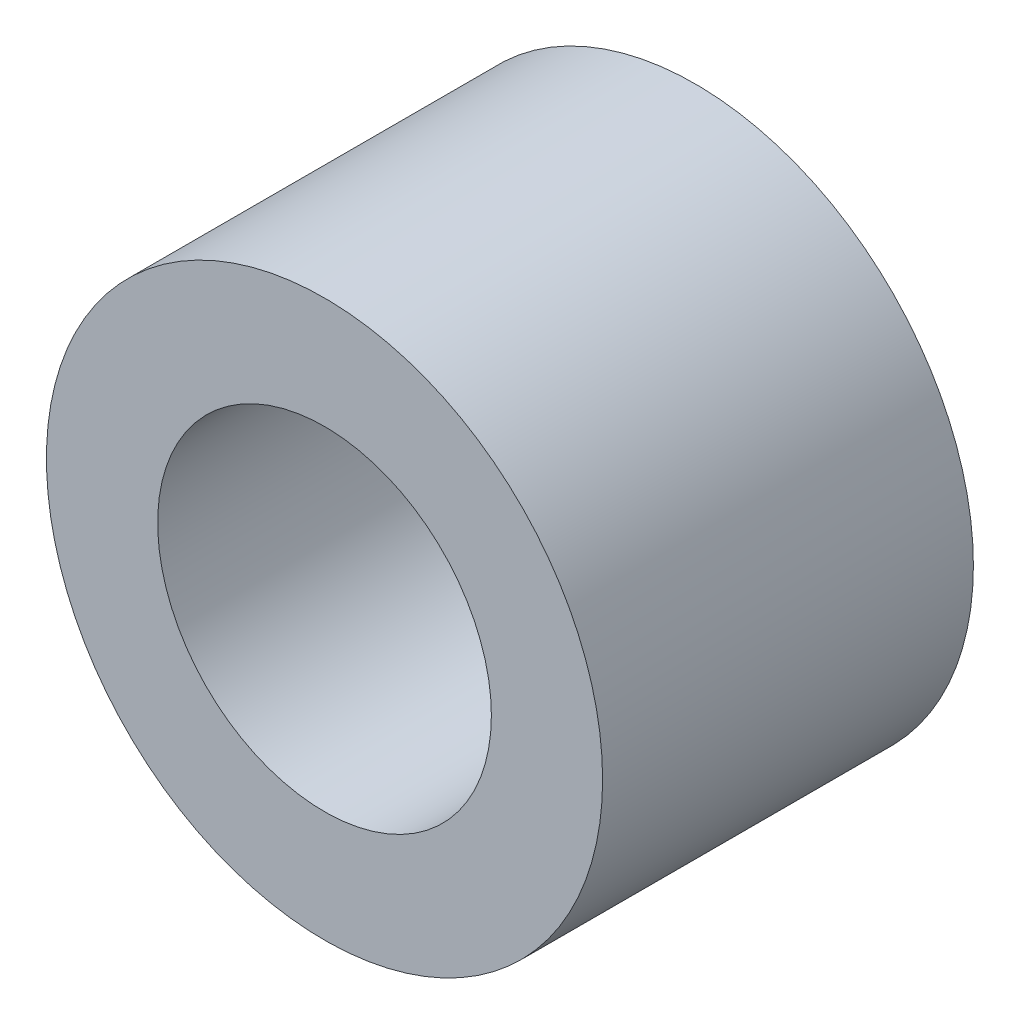
ISO-10303-21;
HEADER;
FILE_DESCRIPTION(('STEP AP214'),'2;1');
FILE_NAME('part.step','',(''),(''),'','','');
FILE_SCHEMA(('AUTOMOTIVE_DESIGN { 1 0 10303 214 1 1 1 1 }'));
ENDSEC;
DATA;
#1=APPLICATION_CONTEXT('core data for automotive mechanical design processes');
#2=APPLICATION_PROTOCOL_DEFINITION('international standard','automotive_design',2000,#1);
#3=PRODUCT_CONTEXT('',#1,'mechanical');
#4=PRODUCT('Part','Part','',(#3));
#5=PRODUCT_RELATED_PRODUCT_CATEGORY('part','',(#4));
#6=PRODUCT_DEFINITION_FORMATION('','',#4);
#7=PRODUCT_DEFINITION_CONTEXT('part definition',#1,'design');
#8=PRODUCT_DEFINITION('design','',#6,#7);
#9=PRODUCT_DEFINITION_SHAPE('','',#8);
#10=(LENGTH_UNIT() NAMED_UNIT(*) SI_UNIT(.MILLI.,.METRE.));
#11=(NAMED_UNIT(*) PLANE_ANGLE_UNIT() SI_UNIT($,.RADIAN.));
#12=(NAMED_UNIT(*) SI_UNIT($,.STERADIAN.) SOLID_ANGLE_UNIT());
#13=UNCERTAINTY_MEASURE_WITH_UNIT(LENGTH_MEASURE(1.E-05),#10,'distance_accuracy_value','');
#14=(GEOMETRIC_REPRESENTATION_CONTEXT(3) GLOBAL_UNCERTAINTY_ASSIGNED_CONTEXT((#13)) GLOBAL_UNIT_ASSIGNED_CONTEXT((#10,
#11,#12)) REPRESENTATION_CONTEXT('',''));
#15=CARTESIAN_POINT('',(0.,0.,0.));
#16=DIRECTION('',(0.,0.,1.));
#17=DIRECTION('',(1.,0.,0.));
#18=AXIS2_PLACEMENT_3D('',#15,#16,#17);
#19=CARTESIAN_POINT('',(0.,0.,10.));
#20=DIRECTION('',(0.,0.,1.));
#21=DIRECTION('',(1.,0.,0.));
#22=AXIS2_PLACEMENT_3D('',#19,#20,#21);
#23=PLANE('',#22);
#24=CARTESIAN_POINT('',(0.,0.,10.));
#25=DIRECTION('',(0.,0.,1.));
#26=DIRECTION('',(1.,0.,0.));
#27=AXIS2_PLACEMENT_3D('',#24,#25,#26);
#28=CIRCLE('',#27,7.5);
#29=CARTESIAN_POINT('',(7.5,0.,10.));
#30=VERTEX_POINT('',#29);
#31=EDGE_CURVE('E10',#30,#30,#28,.T.);
#32=ORIENTED_EDGE('',*,*,#31,.T.);
#33=EDGE_LOOP('',(#32));
#34=FACE_BOUND('',#33,.T.);
#35=CARTESIAN_POINT('',(0.,0.,10.));
#36=DIRECTION('',(0.,0.,1.));
#37=DIRECTION('',(1.,0.,0.));
#38=AXIS2_PLACEMENT_3D('',#35,#36,#37);
#39=CIRCLE('',#38,4.5);
#40=CARTESIAN_POINT('',(4.5,0.,10.));
#41=VERTEX_POINT('',#40);
#42=EDGE_CURVE('E43',#41,#41,#39,.T.);
#43=ORIENTED_EDGE('',*,*,#42,.F.);
#44=EDGE_LOOP('',(#43));
#45=FACE_BOUND('',#44,.T.);
#46=ADVANCED_FACE('F32',(#34,#45),#23,.T.);
#47=CARTESIAN_POINT('',(0.,0.,0.));
#48=DIRECTION('',(0.,0.,1.));
#49=DIRECTION('',(1.,0.,0.));
#50=AXIS2_PLACEMENT_3D('',#47,#48,#49);
#51=PLANE('',#50);
#52=CARTESIAN_POINT('',(0.,0.,0.));
#53=DIRECTION('',(0.,0.,1.));
#54=DIRECTION('',(1.,0.,0.));
#55=AXIS2_PLACEMENT_3D('',#52,#53,#54);
#56=CIRCLE('',#55,7.5);
#57=CARTESIAN_POINT('',(7.5,0.,0.));
#58=VERTEX_POINT('',#57);
#59=EDGE_CURVE('E36',#58,#58,#56,.T.);
#60=ORIENTED_EDGE('',*,*,#59,.F.);
#61=EDGE_LOOP('',(#60));
#62=FACE_BOUND('',#61,.T.);
#63=CARTESIAN_POINT('',(0.,0.,0.));
#64=DIRECTION('',(0.,0.,1.));
#65=DIRECTION('',(1.,0.,0.));
#66=AXIS2_PLACEMENT_3D('',#63,#64,#65);
#67=CIRCLE('',#66,4.5);
#68=CARTESIAN_POINT('',(4.5,0.,0.));
#69=VERTEX_POINT('',#68);
#70=EDGE_CURVE('E45',#69,#69,#67,.T.);
#71=ORIENTED_EDGE('',*,*,#70,.T.);
#72=EDGE_LOOP('',(#71));
#73=FACE_BOUND('',#72,.T.);
#74=ADVANCED_FACE('F55',(#62,#73),#51,.F.);
#75=CARTESIAN_POINT('',(0.,0.,10.));
#76=DIRECTION('',(0.,0.,-1.));
#77=DIRECTION('',(-1.,0.,0.));
#78=AXIS2_PLACEMENT_3D('',#75,#76,#77);
#79=CYLINDRICAL_SURFACE('',#78,7.5);
#80=ORIENTED_EDGE('',*,*,#31,.F.);
#81=EDGE_LOOP('',(#80));
#82=FACE_BOUND('',#81,.T.);
#83=ORIENTED_EDGE('',*,*,#59,.T.);
#84=EDGE_LOOP('',(#83));
#85=FACE_BOUND('',#84,.T.);
#86=ADVANCED_FACE('F34',(#82,#85),#79,.T.);
#87=CARTESIAN_POINT('',(0.,0.,10.));
#88=DIRECTION('',(0.,0.,-1.));
#89=DIRECTION('',(-1.,0.,0.));
#90=AXIS2_PLACEMENT_3D('',#87,#88,#89);
#91=CYLINDRICAL_SURFACE('',#90,4.5);
#92=ORIENTED_EDGE('',*,*,#42,.T.);
#93=EDGE_LOOP('',(#92));
#94=FACE_BOUND('',#93,.T.);
#95=ORIENTED_EDGE('',*,*,#70,.F.);
#96=EDGE_LOOP('',(#95));
#97=FACE_BOUND('',#96,.T.);
#98=ADVANCED_FACE('F51',(#94,#97),#91,.F.);
#99=CLOSED_SHELL('',(#46,#74,#86,#98));
#100=MANIFOLD_SOLID_BREP('B2',#99);
#101=ADVANCED_BREP_SHAPE_REPRESENTATION('',(#18,#100),#14);
#102=SHAPE_DEFINITION_REPRESENTATION(#9,#101);
ENDSEC;
END-ISO-10303-21;
